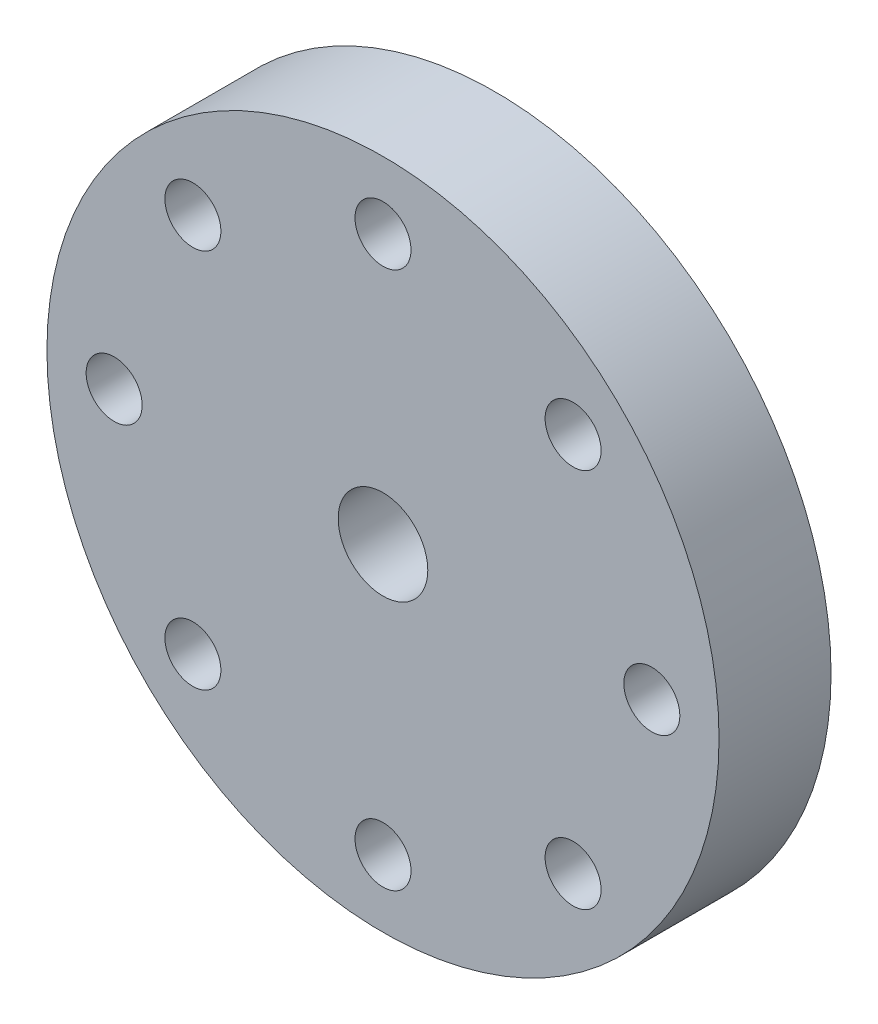
ISO-10303-21;
HEADER;
FILE_DESCRIPTION(('STEP AP214'),'2;1');
FILE_NAME('part.step','',(''),(''),'','','');
FILE_SCHEMA(('AUTOMOTIVE_DESIGN { 1 0 10303 214 1 1 1 1 }'));
ENDSEC;
DATA;
#1=APPLICATION_CONTEXT('core data for automotive mechanical design processes');
#2=APPLICATION_PROTOCOL_DEFINITION('international standard','automotive_design',2000,#1);
#3=PRODUCT_CONTEXT('',#1,'mechanical');
#4=PRODUCT('Part','Part','',(#3));
#5=PRODUCT_RELATED_PRODUCT_CATEGORY('part','',(#4));
#6=PRODUCT_DEFINITION_FORMATION('','',#4);
#7=PRODUCT_DEFINITION_CONTEXT('part definition',#1,'design');
#8=PRODUCT_DEFINITION('design','',#6,#7);
#9=PRODUCT_DEFINITION_SHAPE('','',#8);
#10=(LENGTH_UNIT() NAMED_UNIT(*) SI_UNIT(.MILLI.,.METRE.));
#11=(NAMED_UNIT(*) PLANE_ANGLE_UNIT() SI_UNIT($,.RADIAN.));
#12=(NAMED_UNIT(*) SI_UNIT($,.STERADIAN.) SOLID_ANGLE_UNIT());
#13=UNCERTAINTY_MEASURE_WITH_UNIT(LENGTH_MEASURE(1.E-05),#10,'distance_accuracy_value','');
#14=(GEOMETRIC_REPRESENTATION_CONTEXT(3) GLOBAL_UNCERTAINTY_ASSIGNED_CONTEXT((#13)) GLOBAL_UNIT_ASSIGNED_CONTEXT((#10,
#11,#12)) REPRESENTATION_CONTEXT('',''));
#15=CARTESIAN_POINT('',(0.,0.,0.));
#16=DIRECTION('',(0.,0.,1.));
#17=DIRECTION('',(1.,0.,0.));
#18=AXIS2_PLACEMENT_3D('',#15,#16,#17);
#19=CARTESIAN_POINT('',(0.,0.,5.));
#20=DIRECTION('',(0.,0.,1.));
#21=DIRECTION('',(1.,0.,0.));
#22=AXIS2_PLACEMENT_3D('',#19,#20,#21);
#23=PLANE('',#22);
#24=CARTESIAN_POINT('',(-11.9999999999997,-3.4032572508536E-13,5.));
#25=DIRECTION('',(0.,0.,1.));
#26=DIRECTION('',(1.,0.,0.));
#27=AXIS2_PLACEMENT_3D('',#24,#25,#26);
#28=CIRCLE('',#27,1.25000000000054);
#29=CARTESIAN_POINT('',(-10.7499999999991,-3.4032572508536E-13,5.));
#30=VERTEX_POINT('',#29);
#31=EDGE_CURVE('E67',#30,#30,#28,.T.);
#32=ORIENTED_EDGE('',*,*,#31,.F.);
#33=EDGE_LOOP('',(#32));
#34=FACE_BOUND('',#33,.T.);
#35=CARTESIAN_POINT('',(6.77712297852766E-13,-12.,5.));
#36=DIRECTION('',(0.,0.,1.));
#37=DIRECTION('',(1.,0.,0.));
#38=AXIS2_PLACEMENT_3D('',#35,#36,#37);
#39=CIRCLE('',#38,1.25000000000073);
#40=CARTESIAN_POINT('',(1.25000000000141,-12.,5.));
#41=VERTEX_POINT('',#40);
#42=EDGE_CURVE('E55',#41,#41,#39,.T.);
#43=ORIENTED_EDGE('',*,*,#42,.F.);
#44=EDGE_LOOP('',(#43));
#45=FACE_BOUND('',#44,.T.);
#46=CARTESIAN_POINT('',(12.0000000000003,3.38856148926383E-13,5.));
#47=DIRECTION('',(0.,0.,1.));
#48=DIRECTION('',(1.,0.,0.));
#49=AXIS2_PLACEMENT_3D('',#46,#47,#48);
#50=CIRCLE('',#49,1.25000000000027);
#51=CARTESIAN_POINT('',(13.2500000000006,3.38856148926383E-13,5.));
#52=VERTEX_POINT('',#51);
#53=EDGE_CURVE('E43',#52,#52,#50,.T.);
#54=ORIENTED_EDGE('',*,*,#53,.F.);
#55=EDGE_LOOP('',(#54));
#56=FACE_BOUND('',#55,.T.);
#57=CARTESIAN_POINT('',(0.,0.,5.));
#58=DIRECTION('',(0.,0.,1.));
#59=DIRECTION('',(1.,0.,0.));
#60=AXIS2_PLACEMENT_3D('',#57,#58,#59);
#61=CIRCLE('',#60,2.);
#62=CARTESIAN_POINT('',(2.,0.,5.));
#63=VERTEX_POINT('',#62);
#64=EDGE_CURVE('E31',#63,#63,#61,.T.);
#65=ORIENTED_EDGE('',*,*,#64,.F.);
#66=EDGE_LOOP('',(#65));
#67=FACE_BOUND('',#66,.T.);
#68=CARTESIAN_POINT('',(0.,0.,5.));
#69=DIRECTION('',(0.,0.,1.));
#70=DIRECTION('',(1.,0.,0.));
#71=AXIS2_PLACEMENT_3D('',#68,#69,#70);
#72=CIRCLE('',#71,15.);
#73=CARTESIAN_POINT('',(15.,0.,5.));
#74=VERTEX_POINT('',#73);
#75=EDGE_CURVE('E10',#74,#74,#72,.T.);
#76=ORIENTED_EDGE('',*,*,#75,.T.);
#77=EDGE_LOOP('',(#76));
#78=FACE_BOUND('',#77,.T.);
#79=CARTESIAN_POINT('',(0.,12.,5.));
#80=DIRECTION('',(0.,0.,1.));
#81=DIRECTION('',(1.,0.,0.));
#82=AXIS2_PLACEMENT_3D('',#79,#80,#81);
#83=CIRCLE('',#82,1.25);
#84=CARTESIAN_POINT('',(1.25,12.,5.));
#85=VERTEX_POINT('',#84);
#86=EDGE_CURVE('E26',#85,#85,#83,.T.);
#87=ORIENTED_EDGE('',*,*,#86,.F.);
#88=EDGE_LOOP('',(#87));
#89=FACE_BOUND('',#88,.T.);
#90=CARTESIAN_POINT('',(8.48528137423859,8.48528137423856,5.));
#91=DIRECTION('',(0.,0.,1.));
#92=DIRECTION('',(1.,0.,0.));
#93=AXIS2_PLACEMENT_3D('',#90,#91,#92);
#94=CIRCLE('',#93,1.25);
#95=CARTESIAN_POINT('',(9.73528137423859,8.48528137423856,5.));
#96=VERTEX_POINT('',#95);
#97=EDGE_CURVE('E37',#96,#96,#94,.T.);
#98=ORIENTED_EDGE('',*,*,#97,.F.);
#99=EDGE_LOOP('',(#98));
#100=FACE_BOUND('',#99,.T.);
#101=CARTESIAN_POINT('',(8.48528137423915,-8.48528137423833,5.));
#102=DIRECTION('',(0.,0.,1.));
#103=DIRECTION('',(1.,0.,0.));
#104=AXIS2_PLACEMENT_3D('',#101,#102,#103);
#105=CIRCLE('',#104,1.25000000000054);
#106=CARTESIAN_POINT('',(9.7352813742397,-8.48528137423833,5.));
#107=VERTEX_POINT('',#106);
#108=EDGE_CURVE('E49',#107,#107,#105,.T.);
#109=ORIENTED_EDGE('',*,*,#108,.F.);
#110=EDGE_LOOP('',(#109));
#111=FACE_BOUND('',#110,.T.);
#112=CARTESIAN_POINT('',(-8.48528137423799,-8.48528137423881,5.));
#113=DIRECTION('',(0.,0.,1.));
#114=DIRECTION('',(1.,0.,0.));
#115=AXIS2_PLACEMENT_3D('',#112,#113,#114);
#116=CIRCLE('',#115,1.25000000000072);
#117=CARTESIAN_POINT('',(-7.23528137423727,-8.48528137423881,5.));
#118=VERTEX_POINT('',#117);
#119=EDGE_CURVE('E61',#118,#118,#116,.T.);
#120=ORIENTED_EDGE('',*,*,#119,.F.);
#121=EDGE_LOOP('',(#120));
#122=FACE_BOUND('',#121,.T.);
#123=CARTESIAN_POINT('',(-8.48528137423847,8.48528137423833,5.));
#124=DIRECTION('',(0.,0.,1.));
#125=DIRECTION('',(1.,0.,0.));
#126=AXIS2_PLACEMENT_3D('',#123,#124,#125);
#127=CIRCLE('',#126,1.25000000000031);
#128=CARTESIAN_POINT('',(-7.23528137423816,8.48528137423833,5.));
#129=VERTEX_POINT('',#128);
#130=EDGE_CURVE('E73',#129,#129,#127,.T.);
#131=ORIENTED_EDGE('',*,*,#130,.F.);
#132=EDGE_LOOP('',(#131));
#133=FACE_BOUND('',#132,.T.);
#134=ADVANCED_FACE('F15',(#34,#45,#56,#67,#78,#89,#100,#111,#122,#133),#23,.T.);
#135=CARTESIAN_POINT('',(0.,0.,0.));
#136=DIRECTION('',(0.,0.,1.));
#137=DIRECTION('',(1.,0.,0.));
#138=AXIS2_PLACEMENT_3D('',#135,#136,#137);
#139=PLANE('',#138);
#140=CARTESIAN_POINT('',(0.,0.,0.));
#141=DIRECTION('',(0.,0.,1.));
#142=DIRECTION('',(1.,0.,0.));
#143=AXIS2_PLACEMENT_3D('',#140,#141,#142);
#144=CIRCLE('',#143,15.);
#145=CARTESIAN_POINT('',(15.,0.,0.));
#146=VERTEX_POINT('',#145);
#147=EDGE_CURVE('E19',#146,#146,#144,.T.);
#148=ORIENTED_EDGE('',*,*,#147,.F.);
#149=EDGE_LOOP('',(#148));
#150=FACE_BOUND('',#149,.T.);
#151=CARTESIAN_POINT('',(0.,12.,0.));
#152=DIRECTION('',(0.,0.,1.));
#153=DIRECTION('',(1.,0.,0.));
#154=AXIS2_PLACEMENT_3D('',#151,#152,#153);
#155=CIRCLE('',#154,1.25);
#156=CARTESIAN_POINT('',(1.25,12.,0.));
#157=VERTEX_POINT('',#156);
#158=EDGE_CURVE('E28',#157,#157,#155,.T.);
#159=ORIENTED_EDGE('',*,*,#158,.T.);
#160=EDGE_LOOP('',(#159));
#161=FACE_BOUND('',#160,.T.);
#162=CARTESIAN_POINT('',(0.,0.,0.));
#163=DIRECTION('',(0.,0.,1.));
#164=DIRECTION('',(1.,0.,0.));
#165=AXIS2_PLACEMENT_3D('',#162,#163,#164);
#166=CIRCLE('',#165,2.);
#167=CARTESIAN_POINT('',(2.,0.,0.));
#168=VERTEX_POINT('',#167);
#169=EDGE_CURVE('E34',#168,#168,#166,.T.);
#170=ORIENTED_EDGE('',*,*,#169,.T.);
#171=EDGE_LOOP('',(#170));
#172=FACE_BOUND('',#171,.T.);
#173=CARTESIAN_POINT('',(8.48528137423859,8.48528137423856,0.));
#174=DIRECTION('',(0.,0.,1.));
#175=DIRECTION('',(1.,0.,0.));
#176=AXIS2_PLACEMENT_3D('',#173,#174,#175);
#177=CIRCLE('',#176,1.25);
#178=CARTESIAN_POINT('',(9.73528137423859,8.48528137423856,0.));
#179=VERTEX_POINT('',#178);
#180=EDGE_CURVE('E40',#179,#179,#177,.T.);
#181=ORIENTED_EDGE('',*,*,#180,.T.);
#182=EDGE_LOOP('',(#181));
#183=FACE_BOUND('',#182,.T.);
#184=CARTESIAN_POINT('',(12.0000000000003,3.38856148926383E-13,0.));
#185=DIRECTION('',(0.,0.,1.));
#186=DIRECTION('',(1.,0.,0.));
#187=AXIS2_PLACEMENT_3D('',#184,#185,#186);
#188=CIRCLE('',#187,1.25000000000027);
#189=CARTESIAN_POINT('',(13.2500000000006,3.38856148926383E-13,0.));
#190=VERTEX_POINT('',#189);
#191=EDGE_CURVE('E46',#190,#190,#188,.T.);
#192=ORIENTED_EDGE('',*,*,#191,.T.);
#193=EDGE_LOOP('',(#192));
#194=FACE_BOUND('',#193,.T.);
#195=CARTESIAN_POINT('',(8.48528137423915,-8.48528137423833,0.));
#196=DIRECTION('',(0.,0.,1.));
#197=DIRECTION('',(1.,0.,0.));
#198=AXIS2_PLACEMENT_3D('',#195,#196,#197);
#199=CIRCLE('',#198,1.25000000000054);
#200=CARTESIAN_POINT('',(9.7352813742397,-8.48528137423833,0.));
#201=VERTEX_POINT('',#200);
#202=EDGE_CURVE('E52',#201,#201,#199,.T.);
#203=ORIENTED_EDGE('',*,*,#202,.T.);
#204=EDGE_LOOP('',(#203));
#205=FACE_BOUND('',#204,.T.);
#206=CARTESIAN_POINT('',(6.77712297852766E-13,-12.,0.));
#207=DIRECTION('',(0.,0.,1.));
#208=DIRECTION('',(1.,0.,0.));
#209=AXIS2_PLACEMENT_3D('',#206,#207,#208);
#210=CIRCLE('',#209,1.25000000000073);
#211=CARTESIAN_POINT('',(1.25000000000141,-12.,0.));
#212=VERTEX_POINT('',#211);
#213=EDGE_CURVE('E58',#212,#212,#210,.T.);
#214=ORIENTED_EDGE('',*,*,#213,.T.);
#215=EDGE_LOOP('',(#214));
#216=FACE_BOUND('',#215,.T.);
#217=CARTESIAN_POINT('',(-8.48528137423799,-8.48528137423881,0.));
#218=DIRECTION('',(0.,0.,1.));
#219=DIRECTION('',(1.,0.,0.));
#220=AXIS2_PLACEMENT_3D('',#217,#218,#219);
#221=CIRCLE('',#220,1.25000000000072);
#222=CARTESIAN_POINT('',(-7.23528137423727,-8.48528137423881,0.));
#223=VERTEX_POINT('',#222);
#224=EDGE_CURVE('E64',#223,#223,#221,.T.);
#225=ORIENTED_EDGE('',*,*,#224,.T.);
#226=EDGE_LOOP('',(#225));
#227=FACE_BOUND('',#226,.T.);
#228=CARTESIAN_POINT('',(-11.9999999999997,-3.4032572508536E-13,0.));
#229=DIRECTION('',(0.,0.,1.));
#230=DIRECTION('',(1.,0.,0.));
#231=AXIS2_PLACEMENT_3D('',#228,#229,#230);
#232=CIRCLE('',#231,1.25000000000054);
#233=CARTESIAN_POINT('',(-10.7499999999991,-3.4032572508536E-13,0.));
#234=VERTEX_POINT('',#233);
#235=EDGE_CURVE('E70',#234,#234,#232,.T.);
#236=ORIENTED_EDGE('',*,*,#235,.T.);
#237=EDGE_LOOP('',(#236));
#238=FACE_BOUND('',#237,.T.);
#239=CARTESIAN_POINT('',(-8.48528137423847,8.48528137423833,0.));
#240=DIRECTION('',(0.,0.,1.));
#241=DIRECTION('',(1.,0.,0.));
#242=AXIS2_PLACEMENT_3D('',#239,#240,#241);
#243=CIRCLE('',#242,1.25000000000031);
#244=CARTESIAN_POINT('',(-7.23528137423816,8.48528137423833,0.));
#245=VERTEX_POINT('',#244);
#246=EDGE_CURVE('E76',#245,#245,#243,.T.);
#247=ORIENTED_EDGE('',*,*,#246,.T.);
#248=EDGE_LOOP('',(#247));
#249=FACE_BOUND('',#248,.T.);
#250=ADVANCED_FACE('F86',(#150,#161,#172,#183,#194,#205,#216,#227,#238,#249),#139,.F.);
#251=CARTESIAN_POINT('',(0.,0.,5.));
#252=DIRECTION('',(0.,0.,-1.));
#253=DIRECTION('',(-1.,0.,0.));
#254=AXIS2_PLACEMENT_3D('',#251,#252,#253);
#255=CYLINDRICAL_SURFACE('',#254,15.);
#256=ORIENTED_EDGE('',*,*,#75,.F.);
#257=EDGE_LOOP('',(#256));
#258=FACE_BOUND('',#257,.T.);
#259=ORIENTED_EDGE('',*,*,#147,.T.);
#260=EDGE_LOOP('',(#259));
#261=FACE_BOUND('',#260,.T.);
#262=ADVANCED_FACE('F17',(#258,#261),#255,.T.);
#263=CARTESIAN_POINT('',(0.,12.,5.));
#264=DIRECTION('',(0.,0.,-1.));
#265=DIRECTION('',(-1.,0.,0.));
#266=AXIS2_PLACEMENT_3D('',#263,#264,#265);
#267=CYLINDRICAL_SURFACE('',#266,1.25);
#268=ORIENTED_EDGE('',*,*,#86,.T.);
#269=EDGE_LOOP('',(#268));
#270=FACE_BOUND('',#269,.T.);
#271=ORIENTED_EDGE('',*,*,#158,.F.);
#272=EDGE_LOOP('',(#271));
#273=FACE_BOUND('',#272,.T.);
#274=ADVANCED_FACE('F98',(#270,#273),#267,.F.);
#275=CARTESIAN_POINT('',(0.,0.,5.));
#276=DIRECTION('',(0.,0.,-1.));
#277=DIRECTION('',(-1.,0.,0.));
#278=AXIS2_PLACEMENT_3D('',#275,#276,#277);
#279=CYLINDRICAL_SURFACE('',#278,2.);
#280=ORIENTED_EDGE('',*,*,#64,.T.);
#281=EDGE_LOOP('',(#280));
#282=FACE_BOUND('',#281,.T.);
#283=ORIENTED_EDGE('',*,*,#169,.F.);
#284=EDGE_LOOP('',(#283));
#285=FACE_BOUND('',#284,.T.);
#286=ADVANCED_FACE('F101',(#282,#285),#279,.F.);
#287=CARTESIAN_POINT('',(8.48528137423859,8.48528137423856,5.));
#288=DIRECTION('',(0.,0.,-1.));
#289=DIRECTION('',(-1.,0.,0.));
#290=AXIS2_PLACEMENT_3D('',#287,#288,#289);
#291=CYLINDRICAL_SURFACE('',#290,1.25);
#292=ORIENTED_EDGE('',*,*,#97,.T.);
#293=EDGE_LOOP('',(#292));
#294=FACE_BOUND('',#293,.T.);
#295=ORIENTED_EDGE('',*,*,#180,.F.);
#296=EDGE_LOOP('',(#295));
#297=FACE_BOUND('',#296,.T.);
#298=ADVANCED_FACE('F105',(#294,#297),#291,.F.);
#299=CARTESIAN_POINT('',(12.0000000000003,3.38856148926383E-13,5.));
#300=DIRECTION('',(0.,0.,-1.));
#301=DIRECTION('',(-1.,0.,0.));
#302=AXIS2_PLACEMENT_3D('',#299,#300,#301);
#303=CYLINDRICAL_SURFACE('',#302,1.25000000000027);
#304=ORIENTED_EDGE('',*,*,#53,.T.);
#305=EDGE_LOOP('',(#304));
#306=FACE_BOUND('',#305,.T.);
#307=ORIENTED_EDGE('',*,*,#191,.F.);
#308=EDGE_LOOP('',(#307));
#309=FACE_BOUND('',#308,.T.);
#310=ADVANCED_FACE('F109',(#306,#309),#303,.F.);
#311=CARTESIAN_POINT('',(8.48528137423915,-8.48528137423833,5.));
#312=DIRECTION('',(0.,0.,-1.));
#313=DIRECTION('',(-1.,0.,0.));
#314=AXIS2_PLACEMENT_3D('',#311,#312,#313);
#315=CYLINDRICAL_SURFACE('',#314,1.25000000000054);
#316=ORIENTED_EDGE('',*,*,#108,.T.);
#317=EDGE_LOOP('',(#316));
#318=FACE_BOUND('',#317,.T.);
#319=ORIENTED_EDGE('',*,*,#202,.F.);
#320=EDGE_LOOP('',(#319));
#321=FACE_BOUND('',#320,.T.);
#322=ADVANCED_FACE('F113',(#318,#321),#315,.F.);
#323=CARTESIAN_POINT('',(6.77712297852766E-13,-12.,5.));
#324=DIRECTION('',(0.,0.,-1.));
#325=DIRECTION('',(-1.,0.,0.));
#326=AXIS2_PLACEMENT_3D('',#323,#324,#325);
#327=CYLINDRICAL_SURFACE('',#326,1.25000000000073);
#328=ORIENTED_EDGE('',*,*,#42,.T.);
#329=EDGE_LOOP('',(#328));
#330=FACE_BOUND('',#329,.T.);
#331=ORIENTED_EDGE('',*,*,#213,.F.);
#332=EDGE_LOOP('',(#331));
#333=FACE_BOUND('',#332,.T.);
#334=ADVANCED_FACE('F117',(#330,#333),#327,.F.);
#335=CARTESIAN_POINT('',(-8.48528137423799,-8.48528137423881,5.));
#336=DIRECTION('',(0.,0.,-1.));
#337=DIRECTION('',(-1.,0.,0.));
#338=AXIS2_PLACEMENT_3D('',#335,#336,#337);
#339=CYLINDRICAL_SURFACE('',#338,1.25000000000072);
#340=ORIENTED_EDGE('',*,*,#119,.T.);
#341=EDGE_LOOP('',(#340));
#342=FACE_BOUND('',#341,.T.);
#343=ORIENTED_EDGE('',*,*,#224,.F.);
#344=EDGE_LOOP('',(#343));
#345=FACE_BOUND('',#344,.T.);
#346=ADVANCED_FACE('F121',(#342,#345),#339,.F.);
#347=CARTESIAN_POINT('',(-11.9999999999997,-3.4032572508536E-13,5.));
#348=DIRECTION('',(0.,0.,-1.));
#349=DIRECTION('',(-1.,0.,0.));
#350=AXIS2_PLACEMENT_3D('',#347,#348,#349);
#351=CYLINDRICAL_SURFACE('',#350,1.25000000000054);
#352=ORIENTED_EDGE('',*,*,#31,.T.);
#353=EDGE_LOOP('',(#352));
#354=FACE_BOUND('',#353,.T.);
#355=ORIENTED_EDGE('',*,*,#235,.F.);
#356=EDGE_LOOP('',(#355));
#357=FACE_BOUND('',#356,.T.);
#358=ADVANCED_FACE('F125',(#354,#357),#351,.F.);
#359=CARTESIAN_POINT('',(-8.48528137423847,8.48528137423833,5.));
#360=DIRECTION('',(0.,0.,-1.));
#361=DIRECTION('',(-1.,0.,0.));
#362=AXIS2_PLACEMENT_3D('',#359,#360,#361);
#363=CYLINDRICAL_SURFACE('',#362,1.25000000000031);
#364=ORIENTED_EDGE('',*,*,#130,.T.);
#365=EDGE_LOOP('',(#364));
#366=FACE_BOUND('',#365,.T.);
#367=ORIENTED_EDGE('',*,*,#246,.F.);
#368=EDGE_LOOP('',(#367));
#369=FACE_BOUND('',#368,.T.);
#370=ADVANCED_FACE('F82',(#366,#369),#363,.F.);
#371=CLOSED_SHELL('',(#134,#250,#262,#274,#286,#298,#310,#322,#334,#346,#358,#370));
#372=MANIFOLD_SOLID_BREP('B1',#371);
#373=ADVANCED_BREP_SHAPE_REPRESENTATION('',(#18,#372),#14);
#374=SHAPE_DEFINITION_REPRESENTATION(#9,#373);
ENDSEC;
END-ISO-10303-21;
